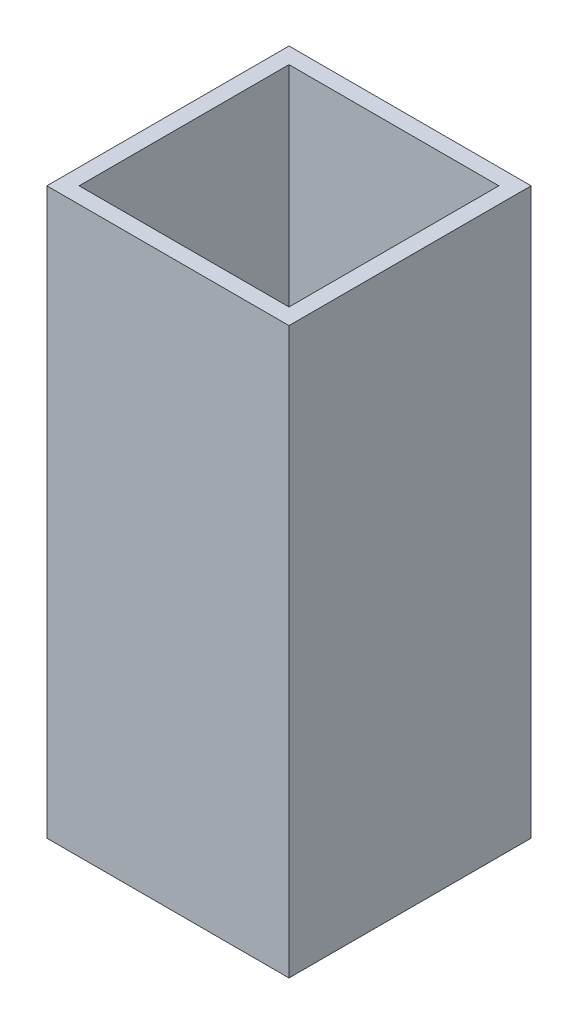
ISO-10303-21;
HEADER;
FILE_DESCRIPTION(('STEP AP214'),'2;1');
FILE_NAME('part.step','',(''),(''),'','','');
FILE_SCHEMA(('AUTOMOTIVE_DESIGN { 1 0 10303 214 1 1 1 1 }'));
ENDSEC;
DATA;
#1=APPLICATION_CONTEXT('core data for automotive mechanical design processes');
#2=APPLICATION_PROTOCOL_DEFINITION('international standard','automotive_design',2000,#1);
#3=PRODUCT_CONTEXT('',#1,'mechanical');
#4=PRODUCT('Part','Part','',(#3));
#5=PRODUCT_RELATED_PRODUCT_CATEGORY('part','',(#4));
#6=PRODUCT_DEFINITION_FORMATION('','',#4);
#7=PRODUCT_DEFINITION_CONTEXT('part definition',#1,'design');
#8=PRODUCT_DEFINITION('design','',#6,#7);
#9=PRODUCT_DEFINITION_SHAPE('','',#8);
#10=(LENGTH_UNIT() NAMED_UNIT(*) SI_UNIT(.MILLI.,.METRE.));
#11=(NAMED_UNIT(*) PLANE_ANGLE_UNIT() SI_UNIT($,.RADIAN.));
#12=(NAMED_UNIT(*) SI_UNIT($,.STERADIAN.) SOLID_ANGLE_UNIT());
#13=UNCERTAINTY_MEASURE_WITH_UNIT(LENGTH_MEASURE(1.E-05),#10,'distance_accuracy_value','');
#14=(GEOMETRIC_REPRESENTATION_CONTEXT(3) GLOBAL_UNCERTAINTY_ASSIGNED_CONTEXT((#13)) GLOBAL_UNIT_ASSIGNED_CONTEXT((#10,
#11,#12)) REPRESENTATION_CONTEXT('',''));
#15=CARTESIAN_POINT('',(0.,0.,0.));
#16=DIRECTION('',(0.,0.,1.));
#17=DIRECTION('',(1.,0.,0.));
#18=AXIS2_PLACEMENT_3D('',#15,#16,#17);
#19=CARTESIAN_POINT('',(0.,70.,0.));
#20=DIRECTION('',(0.,-1.,0.));
#21=DIRECTION('',(0.,0.,-1.));
#22=AXIS2_PLACEMENT_3D('',#19,#20,#21);
#23=PLANE('',#22);
#24=DIRECTION('',(0.,0.,-1.));
#25=VECTOR('',#24,1.);
#26=CARTESIAN_POINT('',(15.,70.,15.));
#27=LINE('',#26,#25);
#28=CARTESIAN_POINT('',(15.,70.,15.));
#29=VERTEX_POINT('',#28);
#30=CARTESIAN_POINT('',(15.,70.,-15.));
#31=VERTEX_POINT('',#30);
#32=EDGE_CURVE('E153',#29,#31,#27,.T.);
#33=ORIENTED_EDGE('',*,*,#32,.T.);
#34=DIRECTION('',(-1.,0.,0.));
#35=VECTOR('',#34,1.);
#36=CARTESIAN_POINT('',(-15.,70.,-15.));
#37=LINE('',#36,#35);
#38=CARTESIAN_POINT('',(-15.,70.,-15.));
#39=VERTEX_POINT('',#38);
#40=EDGE_CURVE('E157',#31,#39,#37,.T.);
#41=ORIENTED_EDGE('',*,*,#40,.T.);
#42=DIRECTION('',(0.,0.,1.));
#43=VECTOR('',#42,1.);
#44=CARTESIAN_POINT('',(-15.,70.,15.));
#45=LINE('',#44,#43);
#46=CARTESIAN_POINT('',(-15.,70.,15.));
#47=VERTEX_POINT('',#46);
#48=EDGE_CURVE('E161',#39,#47,#45,.T.);
#49=ORIENTED_EDGE('',*,*,#48,.T.);
#50=DIRECTION('',(1.,0.,0.));
#51=VECTOR('',#50,1.);
#52=CARTESIAN_POINT('',(-15.,70.,15.));
#53=LINE('',#52,#51);
#54=EDGE_CURVE('E164',#47,#29,#53,.T.);
#55=ORIENTED_EDGE('',*,*,#54,.T.);
#56=EDGE_LOOP('',(#33,#41,#49,#55));
#57=FACE_BOUND('',#56,.T.);
#58=DIRECTION('',(0.,0.,1.));
#59=VECTOR('',#58,1.);
#60=CARTESIAN_POINT('',(-13.,70.,13.));
#61=LINE('',#60,#59);
#62=CARTESIAN_POINT('',(-13.,70.,-13.));
#63=VERTEX_POINT('',#62);
#64=CARTESIAN_POINT('',(-13.,70.,13.));
#65=VERTEX_POINT('',#64);
#66=EDGE_CURVE('E105',#63,#65,#61,.T.);
#67=ORIENTED_EDGE('',*,*,#66,.F.);
#68=DIRECTION('',(-1.,0.,0.));
#69=VECTOR('',#68,1.);
#70=CARTESIAN_POINT('',(-13.,70.,-13.));
#71=LINE('',#70,#69);
#72=CARTESIAN_POINT('',(13.,70.,-13.));
#73=VERTEX_POINT('',#72);
#74=EDGE_CURVE('E131',#73,#63,#71,.T.);
#75=ORIENTED_EDGE('',*,*,#74,.F.);
#76=DIRECTION('',(0.,0.,-1.));
#77=VECTOR('',#76,1.);
#78=CARTESIAN_POINT('',(13.,70.,13.));
#79=LINE('',#78,#77);
#80=CARTESIAN_POINT('',(13.,70.,13.));
#81=VERTEX_POINT('',#80);
#82=EDGE_CURVE('E127',#81,#73,#79,.T.);
#83=ORIENTED_EDGE('',*,*,#82,.F.);
#84=DIRECTION('',(1.,0.,0.));
#85=VECTOR('',#84,1.);
#86=CARTESIAN_POINT('',(-13.,70.,13.));
#87=LINE('',#86,#85);
#88=EDGE_CURVE('E114',#65,#81,#87,.T.);
#89=ORIENTED_EDGE('',*,*,#88,.F.);
#90=EDGE_LOOP('',(#67,#75,#83,#89));
#91=FACE_BOUND('',#90,.T.);
#92=ADVANCED_FACE('F39',(#57,#91),#23,.F.);
#93=CARTESIAN_POINT('',(0.,0.,0.));
#94=DIRECTION('',(0.,-1.,0.));
#95=DIRECTION('',(0.,0.,-1.));
#96=AXIS2_PLACEMENT_3D('',#93,#94,#95);
#97=PLANE('',#96);
#98=DIRECTION('',(0.,0.,-1.));
#99=VECTOR('',#98,1.);
#100=CARTESIAN_POINT('',(15.,0.,15.));
#101=LINE('',#100,#99);
#102=CARTESIAN_POINT('',(15.,0.,15.));
#103=VERTEX_POINT('',#102);
#104=CARTESIAN_POINT('',(15.,0.,-15.));
#105=VERTEX_POINT('',#104);
#106=EDGE_CURVE('E123',#103,#105,#101,.T.);
#107=ORIENTED_EDGE('',*,*,#106,.F.);
#108=DIRECTION('',(1.,0.,0.));
#109=VECTOR('',#108,1.);
#110=CARTESIAN_POINT('',(-15.,0.,15.));
#111=LINE('',#110,#109);
#112=CARTESIAN_POINT('',(-15.,0.,15.));
#113=VERTEX_POINT('',#112);
#114=EDGE_CURVE('E158',#113,#103,#111,.T.);
#115=ORIENTED_EDGE('',*,*,#114,.F.);
#116=DIRECTION('',(0.,0.,1.));
#117=VECTOR('',#116,1.);
#118=CARTESIAN_POINT('',(-15.,0.,15.));
#119=LINE('',#118,#117);
#120=CARTESIAN_POINT('',(-15.,0.,-15.));
#121=VERTEX_POINT('',#120);
#122=EDGE_CURVE('E174',#121,#113,#119,.T.);
#123=ORIENTED_EDGE('',*,*,#122,.F.);
#124=DIRECTION('',(-1.,0.,0.));
#125=VECTOR('',#124,1.);
#126=CARTESIAN_POINT('',(-15.,0.,-15.));
#127=LINE('',#126,#125);
#128=EDGE_CURVE('E171',#105,#121,#127,.T.);
#129=ORIENTED_EDGE('',*,*,#128,.F.);
#130=EDGE_LOOP('',(#107,#115,#123,#129));
#131=FACE_BOUND('',#130,.T.);
#132=DIRECTION('',(-1.,0.,0.));
#133=VECTOR('',#132,1.);
#134=CARTESIAN_POINT('',(-13.,0.,-13.));
#135=LINE('',#134,#133);
#136=CARTESIAN_POINT('',(13.,0.,-13.));
#137=VERTEX_POINT('',#136);
#138=CARTESIAN_POINT('',(-13.,0.,-13.));
#139=VERTEX_POINT('',#138);
#140=EDGE_CURVE('E115',#137,#139,#135,.T.);
#141=ORIENTED_EDGE('',*,*,#140,.T.);
#142=DIRECTION('',(0.,0.,1.));
#143=VECTOR('',#142,1.);
#144=CARTESIAN_POINT('',(-13.,0.,13.));
#145=LINE('',#144,#143);
#146=CARTESIAN_POINT('',(-13.,0.,13.));
#147=VERTEX_POINT('',#146);
#148=EDGE_CURVE('E63',#139,#147,#145,.T.);
#149=ORIENTED_EDGE('',*,*,#148,.T.);
#150=DIRECTION('',(1.,0.,0.));
#151=VECTOR('',#150,1.);
#152=CARTESIAN_POINT('',(-13.,0.,13.));
#153=LINE('',#152,#151);
#154=CARTESIAN_POINT('',(13.,0.,13.));
#155=VERTEX_POINT('',#154);
#156=EDGE_CURVE('E121',#147,#155,#153,.T.);
#157=ORIENTED_EDGE('',*,*,#156,.T.);
#158=DIRECTION('',(0.,0.,-1.));
#159=VECTOR('',#158,1.);
#160=CARTESIAN_POINT('',(13.,0.,13.));
#161=LINE('',#160,#159);
#162=EDGE_CURVE('E140',#155,#137,#161,.T.);
#163=ORIENTED_EDGE('',*,*,#162,.T.);
#164=EDGE_LOOP('',(#141,#149,#157,#163));
#165=FACE_BOUND('',#164,.T.);
#166=ADVANCED_FACE('F197',(#131,#165),#97,.T.);
#167=CARTESIAN_POINT('',(15.,70.,15.));
#168=DIRECTION('',(-1.,0.,0.));
#169=DIRECTION('',(0.,0.,1.));
#170=AXIS2_PLACEMENT_3D('',#167,#168,#169);
#171=PLANE('',#170);
#172=ORIENTED_EDGE('',*,*,#106,.T.);
#173=DIRECTION('',(0.,-1.,0.));
#174=VECTOR('',#173,1.);
#175=CARTESIAN_POINT('',(15.,70.,-15.));
#176=LINE('',#175,#174);
#177=EDGE_CURVE('E11',#31,#105,#176,.T.);
#178=ORIENTED_EDGE('',*,*,#177,.F.);
#179=ORIENTED_EDGE('',*,*,#32,.F.);
#180=DIRECTION('',(0.,-1.,0.));
#181=VECTOR('',#180,1.);
#182=CARTESIAN_POINT('',(15.,70.,15.));
#183=LINE('',#182,#181);
#184=EDGE_CURVE('E167',#29,#103,#183,.T.);
#185=ORIENTED_EDGE('',*,*,#184,.T.);
#186=EDGE_LOOP('',(#172,#178,#179,#185));
#187=FACE_BOUND('',#186,.T.);
#188=ADVANCED_FACE('F41',(#187),#171,.F.);
#189=CARTESIAN_POINT('',(-15.,70.,-15.));
#190=DIRECTION('',(0.,0.,1.));
#191=DIRECTION('',(1.,0.,0.));
#192=AXIS2_PLACEMENT_3D('',#189,#190,#191);
#193=PLANE('',#192);
#194=ORIENTED_EDGE('',*,*,#128,.T.);
#195=DIRECTION('',(0.,-1.,0.));
#196=VECTOR('',#195,1.);
#197=CARTESIAN_POINT('',(-15.,70.,-15.));
#198=LINE('',#197,#196);
#199=EDGE_CURVE('E48',#39,#121,#198,.T.);
#200=ORIENTED_EDGE('',*,*,#199,.F.);
#201=ORIENTED_EDGE('',*,*,#40,.F.);
#202=ORIENTED_EDGE('',*,*,#177,.T.);
#203=EDGE_LOOP('',(#194,#200,#201,#202));
#204=FACE_BOUND('',#203,.T.);
#205=ADVANCED_FACE('F207',(#204),#193,.F.);
#206=CARTESIAN_POINT('',(-15.,70.,15.));
#207=DIRECTION('',(1.,0.,0.));
#208=DIRECTION('',(0.,0.,-1.));
#209=AXIS2_PLACEMENT_3D('',#206,#207,#208);
#210=PLANE('',#209);
#211=ORIENTED_EDGE('',*,*,#122,.T.);
#212=DIRECTION('',(0.,-1.,0.));
#213=VECTOR('',#212,1.);
#214=CARTESIAN_POINT('',(-15.,70.,15.));
#215=LINE('',#214,#213);
#216=EDGE_CURVE('E182',#47,#113,#215,.T.);
#217=ORIENTED_EDGE('',*,*,#216,.F.);
#218=ORIENTED_EDGE('',*,*,#48,.F.);
#219=ORIENTED_EDGE('',*,*,#199,.T.);
#220=EDGE_LOOP('',(#211,#217,#218,#219));
#221=FACE_BOUND('',#220,.T.);
#222=ADVANCED_FACE('F191',(#221),#210,.F.);
#223=CARTESIAN_POINT('',(-15.,70.,15.));
#224=DIRECTION('',(0.,0.,-1.));
#225=DIRECTION('',(-1.,0.,0.));
#226=AXIS2_PLACEMENT_3D('',#223,#224,#225);
#227=PLANE('',#226);
#228=ORIENTED_EDGE('',*,*,#114,.T.);
#229=ORIENTED_EDGE('',*,*,#184,.F.);
#230=ORIENTED_EDGE('',*,*,#54,.F.);
#231=ORIENTED_EDGE('',*,*,#216,.T.);
#232=EDGE_LOOP('',(#228,#229,#230,#231));
#233=FACE_BOUND('',#232,.T.);
#234=ADVANCED_FACE('F201',(#233),#227,.F.);
#235=CARTESIAN_POINT('',(-13.,70.,13.));
#236=DIRECTION('',(1.,0.,0.));
#237=DIRECTION('',(0.,0.,-1.));
#238=AXIS2_PLACEMENT_3D('',#235,#236,#237);
#239=PLANE('',#238);
#240=ORIENTED_EDGE('',*,*,#148,.F.);
#241=DIRECTION('',(0.,-1.,0.));
#242=VECTOR('',#241,1.);
#243=CARTESIAN_POINT('',(-13.,70.,-13.));
#244=LINE('',#243,#242);
#245=EDGE_CURVE('E109',#63,#139,#244,.T.);
#246=ORIENTED_EDGE('',*,*,#245,.F.);
#247=ORIENTED_EDGE('',*,*,#66,.T.);
#248=DIRECTION('',(0.,-1.,0.));
#249=VECTOR('',#248,1.);
#250=CARTESIAN_POINT('',(-13.,70.,13.));
#251=LINE('',#250,#249);
#252=EDGE_CURVE('E108',#65,#147,#251,.T.);
#253=ORIENTED_EDGE('',*,*,#252,.T.);
#254=EDGE_LOOP('',(#240,#246,#247,#253));
#255=FACE_BOUND('',#254,.T.);
#256=ADVANCED_FACE('F107',(#255),#239,.T.);
#257=CARTESIAN_POINT('',(-13.,70.,13.));
#258=DIRECTION('',(0.,0.,-1.));
#259=DIRECTION('',(-1.,0.,0.));
#260=AXIS2_PLACEMENT_3D('',#257,#258,#259);
#261=PLANE('',#260);
#262=ORIENTED_EDGE('',*,*,#156,.F.);
#263=ORIENTED_EDGE('',*,*,#252,.F.);
#264=ORIENTED_EDGE('',*,*,#88,.T.);
#265=DIRECTION('',(0.,-1.,0.));
#266=VECTOR('',#265,1.);
#267=CARTESIAN_POINT('',(13.,70.,13.));
#268=LINE('',#267,#266);
#269=EDGE_CURVE('E124',#81,#155,#268,.T.);
#270=ORIENTED_EDGE('',*,*,#269,.T.);
#271=EDGE_LOOP('',(#262,#263,#264,#270));
#272=FACE_BOUND('',#271,.T.);
#273=ADVANCED_FACE('F118',(#272),#261,.T.);
#274=CARTESIAN_POINT('',(13.,70.,13.));
#275=DIRECTION('',(-1.,0.,0.));
#276=DIRECTION('',(0.,0.,1.));
#277=AXIS2_PLACEMENT_3D('',#274,#275,#276);
#278=PLANE('',#277);
#279=ORIENTED_EDGE('',*,*,#162,.F.);
#280=ORIENTED_EDGE('',*,*,#269,.F.);
#281=ORIENTED_EDGE('',*,*,#82,.T.);
#282=DIRECTION('',(0.,-1.,0.));
#283=VECTOR('',#282,1.);
#284=CARTESIAN_POINT('',(13.,70.,-13.));
#285=LINE('',#284,#283);
#286=EDGE_CURVE('E55',#73,#137,#285,.T.);
#287=ORIENTED_EDGE('',*,*,#286,.T.);
#288=EDGE_LOOP('',(#279,#280,#281,#287));
#289=FACE_BOUND('',#288,.T.);
#290=ADVANCED_FACE('F230',(#289),#278,.T.);
#291=CARTESIAN_POINT('',(-13.,70.,-13.));
#292=DIRECTION('',(0.,0.,1.));
#293=DIRECTION('',(1.,0.,0.));
#294=AXIS2_PLACEMENT_3D('',#291,#292,#293);
#295=PLANE('',#294);
#296=ORIENTED_EDGE('',*,*,#140,.F.);
#297=ORIENTED_EDGE('',*,*,#286,.F.);
#298=ORIENTED_EDGE('',*,*,#74,.T.);
#299=ORIENTED_EDGE('',*,*,#245,.T.);
#300=EDGE_LOOP('',(#296,#297,#298,#299));
#301=FACE_BOUND('',#300,.T.);
#302=ADVANCED_FACE('F234',(#301),#295,.T.);
#303=CLOSED_SHELL('',(#92,#166,#188,#205,#222,#234,#256,#273,#290,#302));
#304=MANIFOLD_SOLID_BREP('B2',#303);
#305=ADVANCED_BREP_SHAPE_REPRESENTATION('',(#18,#304),#14);
#306=SHAPE_DEFINITION_REPRESENTATION(#9,#305);
ENDSEC;
END-ISO-10303-21;
